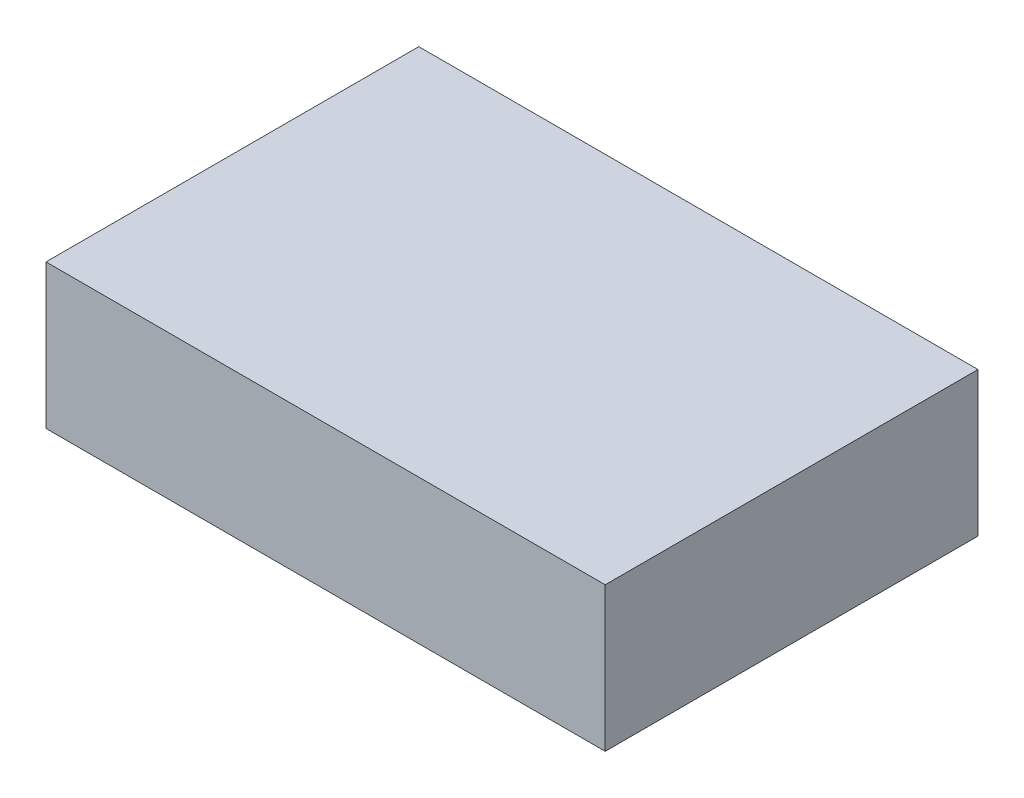
ISO-10303-21;
HEADER;
FILE_DESCRIPTION(('STEP AP214'),'2;1');
FILE_NAME('part.step','',(''),(''),'','','');
FILE_SCHEMA(('AUTOMOTIVE_DESIGN { 1 0 10303 214 1 1 1 1 }'));
ENDSEC;
DATA;
#1=APPLICATION_CONTEXT('core data for automotive mechanical design processes');
#2=APPLICATION_PROTOCOL_DEFINITION('international standard','automotive_design',2000,#1);
#3=PRODUCT_CONTEXT('',#1,'mechanical');
#4=PRODUCT('Part','Part','',(#3));
#5=PRODUCT_RELATED_PRODUCT_CATEGORY('part','',(#4));
#6=PRODUCT_DEFINITION_FORMATION('','',#4);
#7=PRODUCT_DEFINITION_CONTEXT('part definition',#1,'design');
#8=PRODUCT_DEFINITION('design','',#6,#7);
#9=PRODUCT_DEFINITION_SHAPE('','',#8);
#10=(LENGTH_UNIT() NAMED_UNIT(*) SI_UNIT(.MILLI.,.METRE.));
#11=(NAMED_UNIT(*) PLANE_ANGLE_UNIT() SI_UNIT($,.RADIAN.));
#12=(NAMED_UNIT(*) SI_UNIT($,.STERADIAN.) SOLID_ANGLE_UNIT());
#13=UNCERTAINTY_MEASURE_WITH_UNIT(LENGTH_MEASURE(1.E-05),#10,'distance_accuracy_value','');
#14=(GEOMETRIC_REPRESENTATION_CONTEXT(3) GLOBAL_UNCERTAINTY_ASSIGNED_CONTEXT((#13)) GLOBAL_UNIT_ASSIGNED_CONTEXT((#10,
#11,#12)) REPRESENTATION_CONTEXT('',''));
#15=CARTESIAN_POINT('',(0.,0.,0.));
#16=DIRECTION('',(0.,0.,1.));
#17=DIRECTION('',(1.,0.,0.));
#18=AXIS2_PLACEMENT_3D('',#15,#16,#17);
#19=CARTESIAN_POINT('',(-38.1,19.6596,25.4));
#20=DIRECTION('',(1.,0.,0.));
#21=DIRECTION('',(0.,0.,-1.));
#22=AXIS2_PLACEMENT_3D('',#19,#20,#21);
#23=PLANE('',#22);
#24=DIRECTION('',(0.,0.,1.));
#25=VECTOR('',#24,1.);
#26=CARTESIAN_POINT('',(-38.1,0.,25.4));
#27=LINE('',#26,#25);
#28=CARTESIAN_POINT('',(-38.1,0.,-25.4));
#29=VERTEX_POINT('',#28);
#30=CARTESIAN_POINT('',(-38.1,0.,25.4));
#31=VERTEX_POINT('',#30);
#32=EDGE_CURVE('E112',#29,#31,#27,.T.);
#33=ORIENTED_EDGE('',*,*,#32,.T.);
#34=DIRECTION('',(0.,-1.,0.));
#35=VECTOR('',#34,1.);
#36=CARTESIAN_POINT('',(-38.1,19.6596,25.4));
#37=LINE('',#36,#35);
#38=CARTESIAN_POINT('',(-38.1,19.6596,25.4));
#39=VERTEX_POINT('',#38);
#40=EDGE_CURVE('E50',#39,#31,#37,.T.);
#41=ORIENTED_EDGE('',*,*,#40,.F.);
#42=DIRECTION('',(0.,0.,1.));
#43=VECTOR('',#42,1.);
#44=CARTESIAN_POINT('',(-38.1,19.6596,25.4));
#45=LINE('',#44,#43);
#46=CARTESIAN_POINT('',(-38.1,19.6596,-25.4));
#47=VERTEX_POINT('',#46);
#48=EDGE_CURVE('E94',#47,#39,#45,.T.);
#49=ORIENTED_EDGE('',*,*,#48,.F.);
#50=DIRECTION('',(0.,-1.,0.));
#51=VECTOR('',#50,1.);
#52=CARTESIAN_POINT('',(-38.1,19.6596,-25.4));
#53=LINE('',#52,#51);
#54=EDGE_CURVE('E108',#47,#29,#53,.T.);
#55=ORIENTED_EDGE('',*,*,#54,.T.);
#56=EDGE_LOOP('',(#33,#41,#49,#55));
#57=FACE_BOUND('',#56,.T.);
#58=ADVANCED_FACE('F41',(#57),#23,.F.);
#59=CARTESIAN_POINT('',(38.1,19.6596,25.4));
#60=DIRECTION('',(0.,0.,-1.));
#61=DIRECTION('',(-1.,0.,0.));
#62=AXIS2_PLACEMENT_3D('',#59,#60,#61);
#63=PLANE('',#62);
#64=DIRECTION('',(1.,0.,0.));
#65=VECTOR('',#64,1.);
#66=CARTESIAN_POINT('',(38.1,0.,25.4));
#67=LINE('',#66,#65);
#68=CARTESIAN_POINT('',(38.1,0.,25.4));
#69=VERTEX_POINT('',#68);
#70=EDGE_CURVE('E100',#31,#69,#67,.T.);
#71=ORIENTED_EDGE('',*,*,#70,.T.);
#72=DIRECTION('',(0.,-1.,0.));
#73=VECTOR('',#72,1.);
#74=CARTESIAN_POINT('',(38.1,19.6596,25.4));
#75=LINE('',#74,#73);
#76=CARTESIAN_POINT('',(38.1,19.6596,25.4));
#77=VERTEX_POINT('',#76);
#78=EDGE_CURVE('E98',#77,#69,#75,.T.);
#79=ORIENTED_EDGE('',*,*,#78,.F.);
#80=DIRECTION('',(1.,0.,0.));
#81=VECTOR('',#80,1.);
#82=CARTESIAN_POINT('',(38.1,19.6596,25.4));
#83=LINE('',#82,#81);
#84=EDGE_CURVE('E89',#39,#77,#83,.T.);
#85=ORIENTED_EDGE('',*,*,#84,.F.);
#86=ORIENTED_EDGE('',*,*,#40,.T.);
#87=EDGE_LOOP('',(#71,#79,#85,#86));
#88=FACE_BOUND('',#87,.T.);
#89=ADVANCED_FACE('F99',(#88),#63,.F.);
#90=CARTESIAN_POINT('',(38.1,19.6596,25.4));
#91=DIRECTION('',(-1.,0.,0.));
#92=DIRECTION('',(0.,0.,1.));
#93=AXIS2_PLACEMENT_3D('',#90,#91,#92);
#94=PLANE('',#93);
#95=DIRECTION('',(0.,0.,-1.));
#96=VECTOR('',#95,1.);
#97=CARTESIAN_POINT('',(38.1,0.,25.4));
#98=LINE('',#97,#96);
#99=CARTESIAN_POINT('',(38.1,0.,-25.4));
#100=VERTEX_POINT('',#99);
#101=EDGE_CURVE('E75',#69,#100,#98,.T.);
#102=ORIENTED_EDGE('',*,*,#101,.T.);
#103=DIRECTION('',(0.,-1.,0.));
#104=VECTOR('',#103,1.);
#105=CARTESIAN_POINT('',(38.1,19.6596,-25.4));
#106=LINE('',#105,#104);
#107=CARTESIAN_POINT('',(38.1,19.6596,-25.4));
#108=VERTEX_POINT('',#107);
#109=EDGE_CURVE('E102',#108,#100,#106,.T.);
#110=ORIENTED_EDGE('',*,*,#109,.F.);
#111=DIRECTION('',(0.,0.,-1.));
#112=VECTOR('',#111,1.);
#113=CARTESIAN_POINT('',(38.1,19.6596,25.4));
#114=LINE('',#113,#112);
#115=EDGE_CURVE('E92',#77,#108,#114,.T.);
#116=ORIENTED_EDGE('',*,*,#115,.F.);
#117=ORIENTED_EDGE('',*,*,#78,.T.);
#118=EDGE_LOOP('',(#102,#110,#116,#117));
#119=FACE_BOUND('',#118,.T.);
#120=ADVANCED_FACE('F104',(#119),#94,.F.);
#121=CARTESIAN_POINT('',(38.1,19.6596,-25.4));
#122=DIRECTION('',(0.,0.,1.));
#123=DIRECTION('',(1.,0.,0.));
#124=AXIS2_PLACEMENT_3D('',#121,#122,#123);
#125=PLANE('',#124);
#126=DIRECTION('',(-1.,0.,0.));
#127=VECTOR('',#126,1.);
#128=CARTESIAN_POINT('',(38.1,0.,-25.4));
#129=LINE('',#128,#127);
#130=EDGE_CURVE('E81',#100,#29,#129,.T.);
#131=ORIENTED_EDGE('',*,*,#130,.T.);
#132=ORIENTED_EDGE('',*,*,#54,.F.);
#133=DIRECTION('',(-1.,0.,0.));
#134=VECTOR('',#133,1.);
#135=CARTESIAN_POINT('',(38.1,19.6596,-25.4));
#136=LINE('',#135,#134);
#137=EDGE_CURVE('E58',#108,#47,#136,.T.);
#138=ORIENTED_EDGE('',*,*,#137,.F.);
#139=ORIENTED_EDGE('',*,*,#109,.T.);
#140=EDGE_LOOP('',(#131,#132,#138,#139));
#141=FACE_BOUND('',#140,.T.);
#142=ADVANCED_FACE('F142',(#141),#125,.F.);
#143=CARTESIAN_POINT('',(0.,19.6596,0.));
#144=DIRECTION('',(0.,1.,0.));
#145=DIRECTION('',(0.,0.,1.));
#146=AXIS2_PLACEMENT_3D('',#143,#144,#145);
#147=PLANE('',#146);
#148=ORIENTED_EDGE('',*,*,#48,.T.);
#149=ORIENTED_EDGE('',*,*,#84,.T.);
#150=ORIENTED_EDGE('',*,*,#115,.T.);
#151=ORIENTED_EDGE('',*,*,#137,.T.);
#152=EDGE_LOOP('',(#148,#149,#150,#151));
#153=FACE_BOUND('',#152,.T.);
#154=ADVANCED_FACE('F90',(#153),#147,.T.);
#155=CARTESIAN_POINT('',(0.,0.,0.));
#156=DIRECTION('',(0.,1.,0.));
#157=DIRECTION('',(0.,0.,1.));
#158=AXIS2_PLACEMENT_3D('',#155,#156,#157);
#159=PLANE('',#158);
#160=CARTESIAN_POINT('',(0.,0.,0.));
#161=DIRECTION('',(0.,1.,0.));
#162=DIRECTION('',(0.,0.,1.));
#163=AXIS2_PLACEMENT_3D('',#160,#161,#162);
#164=CIRCLE('',#163,2.54);
#165=CARTESIAN_POINT('',(0.,0.,2.54));
#166=VERTEX_POINT('',#165);
#167=EDGE_CURVE('E11',#166,#166,#164,.F.);
#168=ORIENTED_EDGE('',*,*,#167,.F.);
#169=EDGE_LOOP('',(#168));
#170=FACE_BOUND('',#169,.T.);
#171=ORIENTED_EDGE('',*,*,#32,.F.);
#172=ORIENTED_EDGE('',*,*,#130,.F.);
#173=ORIENTED_EDGE('',*,*,#101,.F.);
#174=ORIENTED_EDGE('',*,*,#70,.F.);
#175=EDGE_LOOP('',(#171,#172,#173,#174));
#176=FACE_BOUND('',#175,.T.);
#177=ADVANCED_FACE('F130',(#170,#176),#159,.F.);
#178=CARTESIAN_POINT('',(0.,-6.35,0.));
#179=DIRECTION('',(0.,1.,0.));
#180=DIRECTION('',(0.,0.,1.));
#181=AXIS2_PLACEMENT_3D('',#178,#179,#180);
#182=CYLINDRICAL_SURFACE('',#181,2.54);
#183=CARTESIAN_POINT('',(0.,-6.35,0.));
#184=DIRECTION('',(0.,-1.,0.));
#185=DIRECTION('',(0.,0.,-1.));
#186=AXIS2_PLACEMENT_3D('',#183,#184,#185);
#187=CIRCLE('',#186,2.54);
#188=CARTESIAN_POINT('',(0.,-6.35,-2.54));
#189=VERTEX_POINT('',#188);
#190=EDGE_CURVE('E116',#189,#189,#187,.T.);
#191=ORIENTED_EDGE('',*,*,#190,.F.);
#192=EDGE_LOOP('',(#191));
#193=FACE_BOUND('',#192,.T.);
#194=ORIENTED_EDGE('',*,*,#167,.T.);
#195=EDGE_LOOP('',(#194));
#196=FACE_BOUND('',#195,.T.);
#197=ADVANCED_FACE('F132',(#193,#196),#182,.T.);
#198=CARTESIAN_POINT('',(0.,-6.35,0.));
#199=DIRECTION('',(0.,-1.,0.));
#200=DIRECTION('',(0.,0.,-1.));
#201=AXIS2_PLACEMENT_3D('',#198,#199,#200);
#202=PLANE('',#201);
#203=ORIENTED_EDGE('',*,*,#190,.T.);
#204=EDGE_LOOP('',(#203));
#205=FACE_BOUND('',#204,.T.);
#206=ADVANCED_FACE('F139',(#205),#202,.T.);
#207=CLOSED_SHELL('',(#58,#89,#120,#142,#154,#177,#197,#206));
#208=MANIFOLD_SOLID_BREP('B2',#207);
#209=ADVANCED_BREP_SHAPE_REPRESENTATION('',(#18,#208),#14);
#210=SHAPE_DEFINITION_REPRESENTATION(#9,#209);
ENDSEC;
END-ISO-10303-21;
